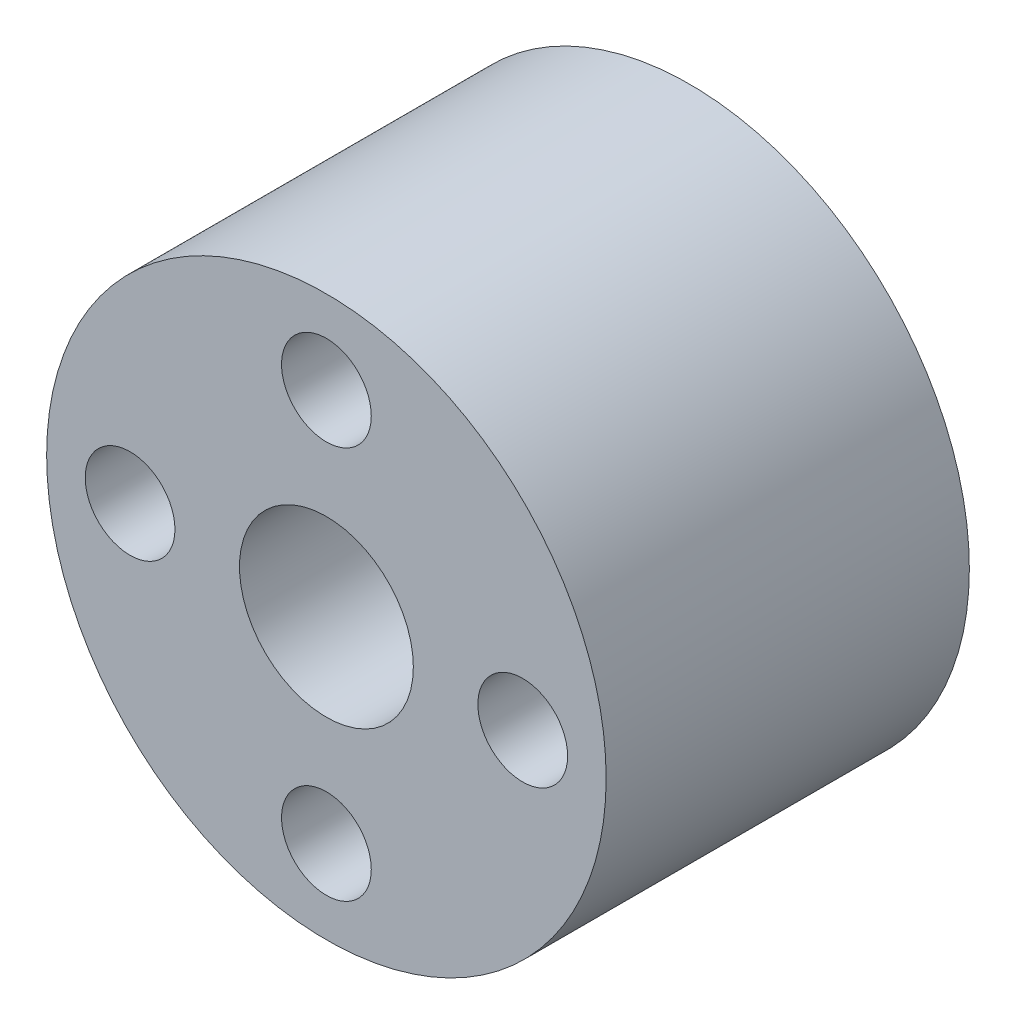
ISO-10303-21;
HEADER;
FILE_DESCRIPTION(('STEP AP214'),'2;1');
FILE_NAME('part.step','',(''),(''),'','','');
FILE_SCHEMA(('AUTOMOTIVE_DESIGN { 1 0 10303 214 1 1 1 1 }'));
ENDSEC;
DATA;
#1=APPLICATION_CONTEXT('core data for automotive mechanical design processes');
#2=APPLICATION_PROTOCOL_DEFINITION('international standard','automotive_design',2000,#1);
#3=PRODUCT_CONTEXT('',#1,'mechanical');
#4=PRODUCT('Part','Part','',(#3));
#5=PRODUCT_RELATED_PRODUCT_CATEGORY('part','',(#4));
#6=PRODUCT_DEFINITION_FORMATION('','',#4);
#7=PRODUCT_DEFINITION_CONTEXT('part definition',#1,'design');
#8=PRODUCT_DEFINITION('design','',#6,#7);
#9=PRODUCT_DEFINITION_SHAPE('','',#8);
#10=(LENGTH_UNIT() NAMED_UNIT(*) SI_UNIT(.MILLI.,.METRE.));
#11=(NAMED_UNIT(*) PLANE_ANGLE_UNIT() SI_UNIT($,.RADIAN.));
#12=(NAMED_UNIT(*) SI_UNIT($,.STERADIAN.) SOLID_ANGLE_UNIT());
#13=UNCERTAINTY_MEASURE_WITH_UNIT(LENGTH_MEASURE(1.E-05),#10,'distance_accuracy_value','');
#14=(GEOMETRIC_REPRESENTATION_CONTEXT(3) GLOBAL_UNCERTAINTY_ASSIGNED_CONTEXT((#13)) GLOBAL_UNIT_ASSIGNED_CONTEXT((#10,
#11,#12)) REPRESENTATION_CONTEXT('',''));
#15=CARTESIAN_POINT('',(0.,0.,0.));
#16=DIRECTION('',(0.,0.,1.));
#17=DIRECTION('',(1.,0.,0.));
#18=AXIS2_PLACEMENT_3D('',#15,#16,#17);
#19=CARTESIAN_POINT('',(0.,7.,0.));
#20=DIRECTION('',(0.,0.,1.));
#21=DIRECTION('',(1.,0.,0.));
#22=AXIS2_PLACEMENT_3D('',#19,#20,#21);
#23=CYLINDRICAL_SURFACE('',#22,1.6);
#24=CARTESIAN_POINT('',(0.,7.,12.95));
#25=DIRECTION('',(0.,0.,1.));
#26=DIRECTION('',(1.,0.,0.));
#27=AXIS2_PLACEMENT_3D('',#24,#25,#26);
#28=CIRCLE('',#27,1.6);
#29=CARTESIAN_POINT('',(1.6,7.,12.95));
#30=VERTEX_POINT('',#29);
#31=EDGE_CURVE('E40',#30,#30,#28,.T.);
#32=ORIENTED_EDGE('',*,*,#31,.T.);
#33=EDGE_LOOP('',(#32));
#34=FACE_BOUND('',#33,.T.);
#35=CARTESIAN_POINT('',(0.,7.,0.));
#36=DIRECTION('',(0.,0.,1.));
#37=DIRECTION('',(1.,0.,0.));
#38=AXIS2_PLACEMENT_3D('',#35,#36,#37);
#39=CIRCLE('',#38,1.6);
#40=CARTESIAN_POINT('',(1.6,7.,0.));
#41=VERTEX_POINT('',#40);
#42=EDGE_CURVE('E9',#41,#41,#39,.T.);
#43=ORIENTED_EDGE('',*,*,#42,.F.);
#44=EDGE_LOOP('',(#43));
#45=FACE_BOUND('',#44,.T.);
#46=ADVANCED_FACE('F14',(#34,#45),#23,.F.);
#47=CARTESIAN_POINT('',(7.,0.,0.));
#48=DIRECTION('',(0.,0.,1.));
#49=DIRECTION('',(1.,0.,0.));
#50=AXIS2_PLACEMENT_3D('',#47,#48,#49);
#51=CYLINDRICAL_SURFACE('',#50,1.6);
#52=CARTESIAN_POINT('',(7.,0.,12.95));
#53=DIRECTION('',(0.,0.,1.));
#54=DIRECTION('',(1.,0.,0.));
#55=AXIS2_PLACEMENT_3D('',#52,#53,#54);
#56=CIRCLE('',#55,1.6);
#57=CARTESIAN_POINT('',(8.6,0.,12.95));
#58=VERTEX_POINT('',#57);
#59=EDGE_CURVE('E44',#58,#58,#56,.T.);
#60=ORIENTED_EDGE('',*,*,#59,.T.);
#61=EDGE_LOOP('',(#60));
#62=FACE_BOUND('',#61,.T.);
#63=CARTESIAN_POINT('',(7.,0.,0.));
#64=DIRECTION('',(0.,0.,1.));
#65=DIRECTION('',(1.,0.,0.));
#66=AXIS2_PLACEMENT_3D('',#63,#64,#65);
#67=CIRCLE('',#66,1.6);
#68=CARTESIAN_POINT('',(8.6,0.,0.));
#69=VERTEX_POINT('',#68);
#70=EDGE_CURVE('E17',#69,#69,#67,.T.);
#71=ORIENTED_EDGE('',*,*,#70,.F.);
#72=EDGE_LOOP('',(#71));
#73=FACE_BOUND('',#72,.T.);
#74=ADVANCED_FACE('F98',(#62,#73),#51,.F.);
#75=CARTESIAN_POINT('',(0.,0.,0.));
#76=DIRECTION('',(0.,0.,1.));
#77=DIRECTION('',(1.,0.,0.));
#78=AXIS2_PLACEMENT_3D('',#75,#76,#77);
#79=CYLINDRICAL_SURFACE('',#78,3.1);
#80=CARTESIAN_POINT('',(0.,0.,12.95));
#81=DIRECTION('',(0.,0.,1.));
#82=DIRECTION('',(1.,0.,0.));
#83=AXIS2_PLACEMENT_3D('',#80,#81,#82);
#84=CIRCLE('',#83,3.1);
#85=CARTESIAN_POINT('',(3.1,0.,12.95));
#86=VERTEX_POINT('',#85);
#87=EDGE_CURVE('E51',#86,#86,#84,.T.);
#88=ORIENTED_EDGE('',*,*,#87,.T.);
#89=EDGE_LOOP('',(#88));
#90=FACE_BOUND('',#89,.T.);
#91=CARTESIAN_POINT('',(0.,0.,0.));
#92=DIRECTION('',(0.,0.,1.));
#93=DIRECTION('',(1.,0.,0.));
#94=AXIS2_PLACEMENT_3D('',#91,#92,#93);
#95=CIRCLE('',#94,3.1);
#96=CARTESIAN_POINT('',(3.1,0.,0.));
#97=VERTEX_POINT('',#96);
#98=EDGE_CURVE('E30',#97,#97,#95,.T.);
#99=ORIENTED_EDGE('',*,*,#98,.F.);
#100=EDGE_LOOP('',(#99));
#101=FACE_BOUND('',#100,.T.);
#102=ADVANCED_FACE('F103',(#90,#101),#79,.F.);
#103=CARTESIAN_POINT('',(-7.,0.,0.));
#104=DIRECTION('',(0.,0.,1.));
#105=DIRECTION('',(1.,0.,0.));
#106=AXIS2_PLACEMENT_3D('',#103,#104,#105);
#107=CYLINDRICAL_SURFACE('',#106,1.6);
#108=CARTESIAN_POINT('',(-7.,0.,12.95));
#109=DIRECTION('',(0.,0.,1.));
#110=DIRECTION('',(1.,0.,0.));
#111=AXIS2_PLACEMENT_3D('',#108,#109,#110);
#112=CIRCLE('',#111,1.6);
#113=CARTESIAN_POINT('',(-5.4,0.,12.95));
#114=VERTEX_POINT('',#113);
#115=EDGE_CURVE('E55',#114,#114,#112,.T.);
#116=ORIENTED_EDGE('',*,*,#115,.T.);
#117=EDGE_LOOP('',(#116));
#118=FACE_BOUND('',#117,.T.);
#119=CARTESIAN_POINT('',(-7.,0.,0.));
#120=DIRECTION('',(0.,0.,1.));
#121=DIRECTION('',(1.,0.,0.));
#122=AXIS2_PLACEMENT_3D('',#119,#120,#121);
#123=CIRCLE('',#122,1.6);
#124=CARTESIAN_POINT('',(-5.4,0.,0.));
#125=VERTEX_POINT('',#124);
#126=EDGE_CURVE('E35',#125,#125,#123,.T.);
#127=ORIENTED_EDGE('',*,*,#126,.F.);
#128=EDGE_LOOP('',(#127));
#129=FACE_BOUND('',#128,.T.);
#130=ADVANCED_FACE('F93',(#118,#129),#107,.F.);
#131=CARTESIAN_POINT('',(0.,-7.,0.));
#132=DIRECTION('',(0.,0.,1.));
#133=DIRECTION('',(1.,0.,0.));
#134=AXIS2_PLACEMENT_3D('',#131,#132,#133);
#135=CYLINDRICAL_SURFACE('',#134,1.6);
#136=CARTESIAN_POINT('',(0.,-7.,12.95));
#137=DIRECTION('',(0.,0.,1.));
#138=DIRECTION('',(1.,0.,0.));
#139=AXIS2_PLACEMENT_3D('',#136,#137,#138);
#140=CIRCLE('',#139,1.6);
#141=CARTESIAN_POINT('',(1.6,-7.,12.95));
#142=VERTEX_POINT('',#141);
#143=EDGE_CURVE('E56',#142,#142,#140,.T.);
#144=ORIENTED_EDGE('',*,*,#143,.T.);
#145=EDGE_LOOP('',(#144));
#146=FACE_BOUND('',#145,.T.);
#147=CARTESIAN_POINT('',(0.,-7.,0.));
#148=DIRECTION('',(0.,0.,1.));
#149=DIRECTION('',(1.,0.,0.));
#150=AXIS2_PLACEMENT_3D('',#147,#148,#149);
#151=CIRCLE('',#150,1.6);
#152=CARTESIAN_POINT('',(1.6,-7.,0.));
#153=VERTEX_POINT('',#152);
#154=EDGE_CURVE('E39',#153,#153,#151,.T.);
#155=ORIENTED_EDGE('',*,*,#154,.F.);
#156=EDGE_LOOP('',(#155));
#157=FACE_BOUND('',#156,.T.);
#158=ADVANCED_FACE('F84',(#146,#157),#135,.F.);
#159=CARTESIAN_POINT('',(0.,0.,0.));
#160=DIRECTION('',(0.,0.,1.));
#161=DIRECTION('',(1.,0.,0.));
#162=AXIS2_PLACEMENT_3D('',#159,#160,#161);
#163=PLANE('',#162);
#164=ORIENTED_EDGE('',*,*,#42,.T.);
#165=EDGE_LOOP('',(#164));
#166=FACE_BOUND('',#165,.T.);
#167=ORIENTED_EDGE('',*,*,#70,.T.);
#168=EDGE_LOOP('',(#167));
#169=FACE_BOUND('',#168,.T.);
#170=ORIENTED_EDGE('',*,*,#98,.T.);
#171=EDGE_LOOP('',(#170));
#172=FACE_BOUND('',#171,.T.);
#173=ORIENTED_EDGE('',*,*,#126,.T.);
#174=EDGE_LOOP('',(#173));
#175=FACE_BOUND('',#174,.T.);
#176=ORIENTED_EDGE('',*,*,#154,.T.);
#177=EDGE_LOOP('',(#176));
#178=FACE_BOUND('',#177,.T.);
#179=CARTESIAN_POINT('',(0.,0.,0.));
#180=DIRECTION('',(0.,0.,1.));
#181=DIRECTION('',(1.,0.,0.));
#182=AXIS2_PLACEMENT_3D('',#179,#180,#181);
#183=CIRCLE('',#182,9.975);
#184=CARTESIAN_POINT('',(9.975,0.,0.));
#185=VERTEX_POINT('',#184);
#186=EDGE_CURVE('E60',#185,#185,#183,.T.);
#187=ORIENTED_EDGE('',*,*,#186,.F.);
#188=EDGE_LOOP('',(#187));
#189=FACE_BOUND('',#188,.T.);
#190=ADVANCED_FACE('F82',(#166,#169,#172,#175,#178,#189),#163,.F.);
#191=CARTESIAN_POINT('',(0.,0.,12.95));
#192=DIRECTION('',(0.,0.,1.));
#193=DIRECTION('',(1.,0.,0.));
#194=AXIS2_PLACEMENT_3D('',#191,#192,#193);
#195=PLANE('',#194);
#196=ORIENTED_EDGE('',*,*,#31,.F.);
#197=EDGE_LOOP('',(#196));
#198=FACE_BOUND('',#197,.T.);
#199=ORIENTED_EDGE('',*,*,#59,.F.);
#200=EDGE_LOOP('',(#199));
#201=FACE_BOUND('',#200,.T.);
#202=ORIENTED_EDGE('',*,*,#87,.F.);
#203=EDGE_LOOP('',(#202));
#204=FACE_BOUND('',#203,.T.);
#205=ORIENTED_EDGE('',*,*,#115,.F.);
#206=EDGE_LOOP('',(#205));
#207=FACE_BOUND('',#206,.T.);
#208=ORIENTED_EDGE('',*,*,#143,.F.);
#209=EDGE_LOOP('',(#208));
#210=FACE_BOUND('',#209,.T.);
#211=CARTESIAN_POINT('',(0.,0.,12.95));
#212=DIRECTION('',(0.,0.,1.));
#213=DIRECTION('',(1.,0.,0.));
#214=AXIS2_PLACEMENT_3D('',#211,#212,#213);
#215=CIRCLE('',#214,9.975);
#216=CARTESIAN_POINT('',(9.975,0.,12.95));
#217=VERTEX_POINT('',#216);
#218=EDGE_CURVE('E64',#217,#217,#215,.T.);
#219=ORIENTED_EDGE('',*,*,#218,.T.);
#220=EDGE_LOOP('',(#219));
#221=FACE_BOUND('',#220,.T.);
#222=ADVANCED_FACE('F74',(#198,#201,#204,#207,#210,#221),#195,.T.);
#223=CARTESIAN_POINT('',(0.,0.,0.));
#224=DIRECTION('',(0.,0.,1.));
#225=DIRECTION('',(1.,0.,0.));
#226=AXIS2_PLACEMENT_3D('',#223,#224,#225);
#227=CYLINDRICAL_SURFACE('',#226,9.975);
#228=ORIENTED_EDGE('',*,*,#218,.F.);
#229=EDGE_LOOP('',(#228));
#230=FACE_BOUND('',#229,.T.);
#231=ORIENTED_EDGE('',*,*,#186,.T.);
#232=EDGE_LOOP('',(#231));
#233=FACE_BOUND('',#232,.T.);
#234=ADVANCED_FACE('F76',(#230,#233),#227,.T.);
#235=CLOSED_SHELL('',(#46,#74,#102,#130,#158,#190,#222,#234));
#236=MANIFOLD_SOLID_BREP('B1',#235);
#237=ADVANCED_BREP_SHAPE_REPRESENTATION('',(#18,#236),#14);
#238=SHAPE_DEFINITION_REPRESENTATION(#9,#237);
ENDSEC;
END-ISO-10303-21;
